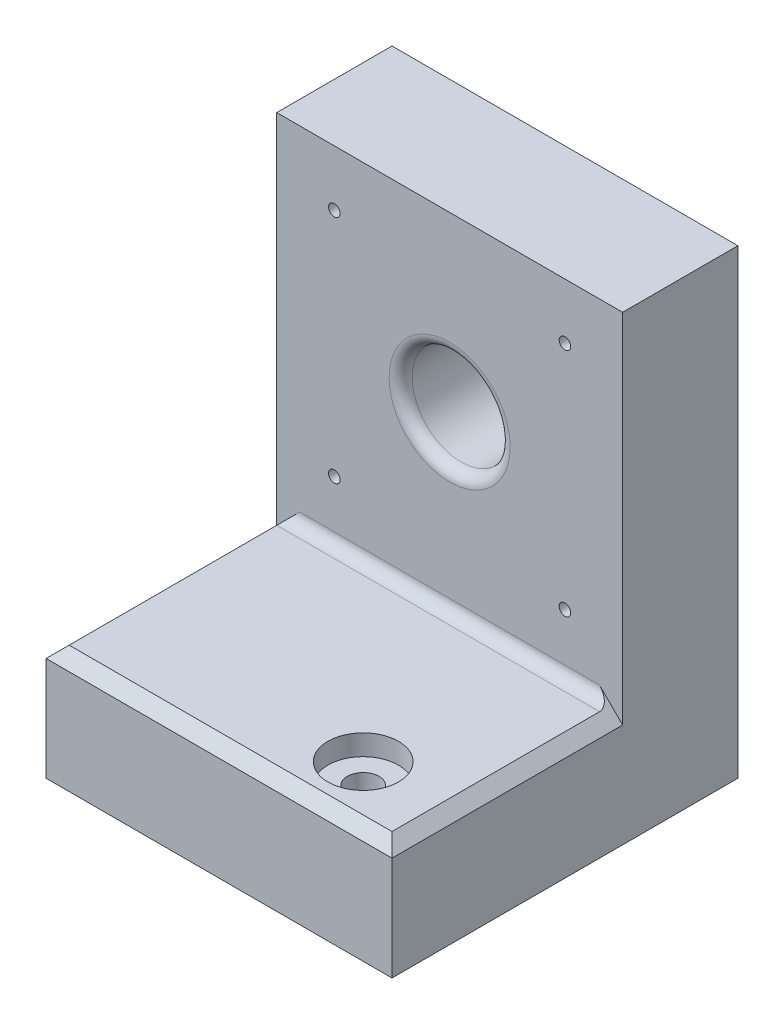
ISO-10303-21;
HEADER;
FILE_DESCRIPTION(('STEP AP214'),'2;1');
FILE_NAME('part.step','',(''),(''),'','','');
FILE_SCHEMA(('AUTOMOTIVE_DESIGN { 1 0 10303 214 1 1 1 1 }'));
ENDSEC;
DATA;
#1=APPLICATION_CONTEXT('core data for automotive mechanical design processes');
#2=APPLICATION_PROTOCOL_DEFINITION('international standard','automotive_design',2000,#1);
#3=PRODUCT_CONTEXT('',#1,'mechanical');
#4=PRODUCT('Part','Part','',(#3));
#5=PRODUCT_RELATED_PRODUCT_CATEGORY('part','',(#4));
#6=PRODUCT_DEFINITION_FORMATION('','',#4);
#7=PRODUCT_DEFINITION_CONTEXT('part definition',#1,'design');
#8=PRODUCT_DEFINITION('design','',#6,#7);
#9=PRODUCT_DEFINITION_SHAPE('','',#8);
#10=(LENGTH_UNIT() NAMED_UNIT(*) SI_UNIT(.MILLI.,.METRE.));
#11=(NAMED_UNIT(*) PLANE_ANGLE_UNIT() SI_UNIT($,.RADIAN.));
#12=(NAMED_UNIT(*) SI_UNIT($,.STERADIAN.) SOLID_ANGLE_UNIT());
#13=UNCERTAINTY_MEASURE_WITH_UNIT(LENGTH_MEASURE(1.E-05),#10,'distance_accuracy_value','');
#14=(GEOMETRIC_REPRESENTATION_CONTEXT(3) GLOBAL_UNCERTAINTY_ASSIGNED_CONTEXT((#13)) GLOBAL_UNIT_ASSIGNED_CONTEXT((#10,
#11,#12)) REPRESENTATION_CONTEXT('',''));
#15=CARTESIAN_POINT('',(0.,0.,0.));
#16=DIRECTION('',(0.,0.,1.));
#17=DIRECTION('',(1.,0.,0.));
#18=AXIS2_PLACEMENT_3D('',#15,#16,#17);
#19=CARTESIAN_POINT('',(60.,0.,0.));
#20=DIRECTION('',(0.,1.,0.));
#21=DIRECTION('',(0.,0.,1.));
#22=AXIS2_PLACEMENT_3D('',#19,#20,#21);
#23=PLANE('',#22);
#24=CARTESIAN_POINT('',(45.,0.,50.));
#25=DIRECTION('',(0.,1.,0.));
#26=DIRECTION('',(0.,0.,1.));
#27=AXIS2_PLACEMENT_3D('',#24,#25,#26);
#28=CIRCLE('',#27,2.75);
#29=CARTESIAN_POINT('',(45.,0.,52.75));
#30=VERTEX_POINT('',#29);
#31=EDGE_CURVE('E491',#30,#30,#28,.T.);
#32=ORIENTED_EDGE('',*,*,#31,.T.);
#33=EDGE_LOOP('',(#32));
#34=FACE_BOUND('',#33,.T.);
#35=DIRECTION('',(0.,0.,-1.));
#36=VECTOR('',#35,1.);
#37=CARTESIAN_POINT('',(0.,0.,0.));
#38=LINE('',#37,#36);
#39=CARTESIAN_POINT('',(0.,0.,60.));
#40=VERTEX_POINT('',#39);
#41=CARTESIAN_POINT('',(0.,0.,0.));
#42=VERTEX_POINT('',#41);
#43=EDGE_CURVE('E143',#40,#42,#38,.T.);
#44=ORIENTED_EDGE('',*,*,#43,.T.);
#45=DIRECTION('',(-1.,0.,0.));
#46=VECTOR('',#45,1.);
#47=CARTESIAN_POINT('',(60.,0.,0.));
#48=LINE('',#47,#46);
#49=CARTESIAN_POINT('',(60.,0.,0.));
#50=VERTEX_POINT('',#49);
#51=EDGE_CURVE('E123',#50,#42,#48,.T.);
#52=ORIENTED_EDGE('',*,*,#51,.F.);
#53=DIRECTION('',(0.,0.,-1.));
#54=VECTOR('',#53,1.);
#55=CARTESIAN_POINT('',(60.,0.,0.));
#56=LINE('',#55,#54);
#57=CARTESIAN_POINT('',(60.,0.,60.));
#58=VERTEX_POINT('',#57);
#59=EDGE_CURVE('E130',#58,#50,#56,.T.);
#60=ORIENTED_EDGE('',*,*,#59,.F.);
#61=DIRECTION('',(-1.,0.,0.));
#62=VECTOR('',#61,1.);
#63=CARTESIAN_POINT('',(60.,0.,60.));
#64=LINE('',#63,#62);
#65=EDGE_CURVE('E207',#58,#40,#64,.T.);
#66=ORIENTED_EDGE('',*,*,#65,.T.);
#67=EDGE_LOOP('',(#44,#52,#60,#66));
#68=FACE_BOUND('',#67,.T.);
#69=ADVANCED_FACE('F48',(#34,#68),#23,.F.);
#70=CARTESIAN_POINT('',(60.,0.,0.));
#71=DIRECTION('',(0.,0.,1.));
#72=DIRECTION('',(1.,0.,0.));
#73=AXIS2_PLACEMENT_3D('',#70,#71,#72);
#74=PLANE('',#73);
#75=CARTESIAN_POINT('',(30.,50.,0.));
#76=DIRECTION('',(0.,0.,1.));
#77=DIRECTION('',(1.,0.,0.));
#78=AXIS2_PLACEMENT_3D('',#75,#76,#77);
#79=CIRCLE('',#78,10.5);
#80=CARTESIAN_POINT('',(40.5,50.,0.));
#81=VERTEX_POINT('',#80);
#82=EDGE_CURVE('E158',#81,#81,#79,.T.);
#83=ORIENTED_EDGE('',*,*,#82,.T.);
#84=EDGE_LOOP('',(#83));
#85=FACE_BOUND('',#84,.T.);
#86=DIRECTION('',(0.,1.,0.));
#87=VECTOR('',#86,1.);
#88=CARTESIAN_POINT('',(0.,0.,0.));
#89=LINE('',#88,#87);
#90=CARTESIAN_POINT('',(0.,80.,0.));
#91=VERTEX_POINT('',#90);
#92=EDGE_CURVE('E214',#42,#91,#89,.T.);
#93=ORIENTED_EDGE('',*,*,#92,.T.);
#94=DIRECTION('',(-1.,0.,0.));
#95=VECTOR('',#94,1.);
#96=CARTESIAN_POINT('',(60.,80.,0.));
#97=LINE('',#96,#95);
#98=CARTESIAN_POINT('',(60.,80.,0.));
#99=VERTEX_POINT('',#98);
#100=EDGE_CURVE('E126',#99,#91,#97,.T.);
#101=ORIENTED_EDGE('',*,*,#100,.F.);
#102=DIRECTION('',(0.,1.,0.));
#103=VECTOR('',#102,1.);
#104=CARTESIAN_POINT('',(60.,0.,0.));
#105=LINE('',#104,#103);
#106=EDGE_CURVE('E119',#50,#99,#105,.T.);
#107=ORIENTED_EDGE('',*,*,#106,.F.);
#108=ORIENTED_EDGE('',*,*,#51,.T.);
#109=EDGE_LOOP('',(#93,#101,#107,#108));
#110=FACE_BOUND('',#109,.T.);
#111=ADVANCED_FACE('F121',(#85,#110),#74,.F.);
#112=CARTESIAN_POINT('',(60.,80.,0.));
#113=DIRECTION('',(0.,-1.,0.));
#114=DIRECTION('',(0.,0.,-1.));
#115=AXIS2_PLACEMENT_3D('',#112,#113,#114);
#116=PLANE('',#115);
#117=DIRECTION('',(0.,0.,1.));
#118=VECTOR('',#117,1.);
#119=CARTESIAN_POINT('',(0.,80.,0.));
#120=LINE('',#119,#118);
#121=CARTESIAN_POINT('',(0.,80.,20.));
#122=VERTEX_POINT('',#121);
#123=EDGE_CURVE('E217',#91,#122,#120,.T.);
#124=ORIENTED_EDGE('',*,*,#123,.T.);
#125=DIRECTION('',(-1.,0.,0.));
#126=VECTOR('',#125,1.);
#127=CARTESIAN_POINT('',(60.,80.,20.));
#128=LINE('',#127,#126);
#129=CARTESIAN_POINT('',(60.,80.,20.));
#130=VERTEX_POINT('',#129);
#131=EDGE_CURVE('E149',#130,#122,#128,.T.);
#132=ORIENTED_EDGE('',*,*,#131,.F.);
#133=DIRECTION('',(0.,0.,1.));
#134=VECTOR('',#133,1.);
#135=CARTESIAN_POINT('',(60.,80.,0.));
#136=LINE('',#135,#134);
#137=EDGE_CURVE('E129',#99,#130,#136,.T.);
#138=ORIENTED_EDGE('',*,*,#137,.F.);
#139=ORIENTED_EDGE('',*,*,#100,.T.);
#140=EDGE_LOOP('',(#124,#132,#138,#139));
#141=FACE_BOUND('',#140,.T.);
#142=ADVANCED_FACE('F240',(#141),#116,.F.);
#143=CARTESIAN_POINT('',(60.,80.,20.));
#144=DIRECTION('',(0.,0.,-1.));
#145=DIRECTION('',(0.,1.,0.));
#146=AXIS2_PLACEMENT_3D('',#143,#144,#145);
#147=PLANE('',#146);
#148=CARTESIAN_POINT('',(10.,30.3389699985161,20.));
#149=DIRECTION('',(0.,0.,1.));
#150=DIRECTION('',(1.,0.,0.));
#151=AXIS2_PLACEMENT_3D('',#148,#149,#150);
#152=CIRCLE('',#151,1.);
#153=CARTESIAN_POINT('',(11.,30.3389699985161,20.));
#154=VERTEX_POINT('',#153);
#155=EDGE_CURVE('E470',#154,#154,#152,.T.);
#156=ORIENTED_EDGE('',*,*,#155,.F.);
#157=EDGE_LOOP('',(#156));
#158=FACE_BOUND('',#157,.T.);
#159=CARTESIAN_POINT('',(50.,30.3389699985161,20.));
#160=DIRECTION('',(0.,0.,1.));
#161=DIRECTION('',(1.,0.,0.));
#162=AXIS2_PLACEMENT_3D('',#159,#160,#161);
#163=CIRCLE('',#162,0.999999999999998);
#164=CARTESIAN_POINT('',(51.,30.3389699985161,20.));
#165=VERTEX_POINT('',#164);
#166=EDGE_CURVE('E477',#165,#165,#163,.T.);
#167=ORIENTED_EDGE('',*,*,#166,.F.);
#168=EDGE_LOOP('',(#167));
#169=FACE_BOUND('',#168,.T.);
#170=CARTESIAN_POINT('',(50.,70.3389699985161,20.));
#171=DIRECTION('',(0.,0.,1.));
#172=DIRECTION('',(1.,0.,0.));
#173=AXIS2_PLACEMENT_3D('',#170,#171,#172);
#174=CIRCLE('',#173,0.999999999999998);
#175=CARTESIAN_POINT('',(51.,70.3389699985161,20.));
#176=VERTEX_POINT('',#175);
#177=EDGE_CURVE('E483',#176,#176,#174,.T.);
#178=ORIENTED_EDGE('',*,*,#177,.F.);
#179=EDGE_LOOP('',(#178));
#180=FACE_BOUND('',#179,.T.);
#181=CARTESIAN_POINT('',(10.,70.3389699985161,20.));
#182=DIRECTION('',(0.,0.,1.));
#183=DIRECTION('',(1.,0.,0.));
#184=AXIS2_PLACEMENT_3D('',#181,#182,#183);
#185=CIRCLE('',#184,1.);
#186=CARTESIAN_POINT('',(11.,70.3389699985161,20.));
#187=VERTEX_POINT('',#186);
#188=EDGE_CURVE('E464',#187,#187,#185,.T.);
#189=ORIENTED_EDGE('',*,*,#188,.F.);
#190=EDGE_LOOP('',(#189));
#191=FACE_BOUND('',#190,.T.);
#192=CARTESIAN_POINT('',(30.,50.,20.));
#193=DIRECTION('',(0.,0.,-1.));
#194=DIRECTION('',(0.,1.,0.));
#195=AXIS2_PLACEMENT_3D('',#192,#193,#194);
#196=CIRCLE('',#195,10.5);
#197=CARTESIAN_POINT('',(30.,60.5,20.));
#198=VERTEX_POINT('',#197);
#199=EDGE_CURVE('E155',#198,#198,#196,.T.);
#200=ORIENTED_EDGE('',*,*,#199,.T.);
#201=EDGE_LOOP('',(#200));
#202=FACE_BOUND('',#201,.T.);
#203=DIRECTION('',(0.707106781186548,0.707106781186548,0.));
#204=VECTOR('',#203,1.);
#205=CARTESIAN_POINT('',(61.,79.,20.));
#206=LINE('',#205,#204);
#207=CARTESIAN_POINT('',(0.,18.,20.));
#208=VERTEX_POINT('',#207);
#209=CARTESIAN_POINT('',(4.,22.,20.));
#210=VERTEX_POINT('',#209);
#211=EDGE_CURVE('E63',#208,#210,#206,.T.);
#212=ORIENTED_EDGE('',*,*,#211,.T.);
#213=DIRECTION('',(-1.,0.,0.));
#214=VECTOR('',#213,1.);
#215=CARTESIAN_POINT('',(58.,22.,20.));
#216=LINE('',#215,#214);
#217=CARTESIAN_POINT('',(56.,22.,20.));
#218=VERTEX_POINT('',#217);
#219=EDGE_CURVE('E186',#210,#218,#216,.F.);
#220=ORIENTED_EDGE('',*,*,#219,.T.);
#221=DIRECTION('',(-0.707106781186548,0.707106781186548,0.));
#222=VECTOR('',#221,1.);
#223=CARTESIAN_POINT('',(29.,49.,20.));
#224=LINE('',#223,#222);
#225=CARTESIAN_POINT('',(60.,18.,20.));
#226=VERTEX_POINT('',#225);
#227=EDGE_CURVE('E70',#218,#226,#224,.F.);
#228=ORIENTED_EDGE('',*,*,#227,.T.);
#229=DIRECTION('',(0.,-1.,0.));
#230=VECTOR('',#229,1.);
#231=CARTESIAN_POINT('',(60.,80.,20.));
#232=LINE('',#231,#230);
#233=EDGE_CURVE('E199',#130,#226,#232,.T.);
#234=ORIENTED_EDGE('',*,*,#233,.F.);
#235=ORIENTED_EDGE('',*,*,#131,.T.);
#236=DIRECTION('',(0.,-1.,0.));
#237=VECTOR('',#236,1.);
#238=CARTESIAN_POINT('',(0.,80.,20.));
#239=LINE('',#238,#237);
#240=EDGE_CURVE('E219',#122,#208,#239,.T.);
#241=ORIENTED_EDGE('',*,*,#240,.T.);
#242=EDGE_LOOP('',(#212,#220,#228,#234,#235,#241));
#243=FACE_BOUND('',#242,.T.);
#244=ADVANCED_FACE('F196',(#158,#169,#180,#191,#202,#243),#147,.F.);
#245=CARTESIAN_POINT('',(60.,20.,20.));
#246=DIRECTION('',(0.,-1.,0.));
#247=DIRECTION('',(0.,0.,-1.));
#248=AXIS2_PLACEMENT_3D('',#245,#246,#247);
#249=PLANE('',#248);
#250=CARTESIAN_POINT('',(45.,20.,50.));
#251=DIRECTION('',(0.,1.,0.));
#252=DIRECTION('',(0.,0.,1.));
#253=AXIS2_PLACEMENT_3D('',#250,#251,#252);
#254=CIRCLE('',#253,6.12);
#255=CARTESIAN_POINT('',(45.,20.,56.12));
#256=VERTEX_POINT('',#255);
#257=EDGE_CURVE('E488',#256,#256,#254,.T.);
#258=ORIENTED_EDGE('',*,*,#257,.F.);
#259=EDGE_LOOP('',(#258));
#260=FACE_BOUND('',#259,.T.);
#261=DIRECTION('',(0.,0.,-1.));
#262=VECTOR('',#261,1.);
#263=CARTESIAN_POINT('',(58.,20.,20.));
#264=LINE('',#263,#262);
#265=CARTESIAN_POINT('',(58.,20.,58.));
#266=VERTEX_POINT('',#265);
#267=CARTESIAN_POINT('',(58.,20.,22.));
#268=VERTEX_POINT('',#267);
#269=EDGE_CURVE('E167',#266,#268,#264,.T.);
#270=ORIENTED_EDGE('',*,*,#269,.T.);
#271=DIRECTION('',(-1.,0.,0.));
#272=VECTOR('',#271,1.);
#273=CARTESIAN_POINT('',(2.,20.,22.));
#274=LINE('',#273,#272);
#275=CARTESIAN_POINT('',(2.,20.,22.));
#276=VERTEX_POINT('',#275);
#277=EDGE_CURVE('E177',#268,#276,#274,.T.);
#278=ORIENTED_EDGE('',*,*,#277,.T.);
#279=DIRECTION('',(0.,0.,1.));
#280=VECTOR('',#279,1.);
#281=CARTESIAN_POINT('',(2.,20.,60.));
#282=LINE('',#281,#280);
#283=CARTESIAN_POINT('',(2.,20.,58.));
#284=VERTEX_POINT('',#283);
#285=EDGE_CURVE('E165',#276,#284,#282,.T.);
#286=ORIENTED_EDGE('',*,*,#285,.T.);
#287=DIRECTION('',(1.,0.,0.));
#288=VECTOR('',#287,1.);
#289=CARTESIAN_POINT('',(60.,20.,58.));
#290=LINE('',#289,#288);
#291=EDGE_CURVE('E163',#284,#266,#290,.T.);
#292=ORIENTED_EDGE('',*,*,#291,.T.);
#293=EDGE_LOOP('',(#270,#278,#286,#292));
#294=FACE_BOUND('',#293,.T.);
#295=ADVANCED_FACE('F231',(#260,#294),#249,.F.);
#296=CARTESIAN_POINT('',(60.,0.,60.));
#297=DIRECTION('',(0.,0.,-1.));
#298=DIRECTION('',(-1.,0.,0.));
#299=AXIS2_PLACEMENT_3D('',#296,#297,#298);
#300=PLANE('',#299);
#301=DIRECTION('',(0.,-1.,0.));
#302=VECTOR('',#301,1.);
#303=CARTESIAN_POINT('',(60.,0.,60.));
#304=LINE('',#303,#302);
#305=CARTESIAN_POINT('',(60.,18.,60.));
#306=VERTEX_POINT('',#305);
#307=EDGE_CURVE('E136',#306,#58,#304,.T.);
#308=ORIENTED_EDGE('',*,*,#307,.F.);
#309=DIRECTION('',(-1.,0.,0.));
#310=VECTOR('',#309,1.);
#311=CARTESIAN_POINT('',(60.,18.,60.));
#312=LINE('',#311,#310);
#313=CARTESIAN_POINT('',(0.,18.,60.));
#314=VERTEX_POINT('',#313);
#315=EDGE_CURVE('E173',#306,#314,#312,.T.);
#316=ORIENTED_EDGE('',*,*,#315,.T.);
#317=DIRECTION('',(0.,-1.,0.));
#318=VECTOR('',#317,1.);
#319=CARTESIAN_POINT('',(0.,0.,60.));
#320=LINE('',#319,#318);
#321=EDGE_CURVE('E140',#314,#40,#320,.T.);
#322=ORIENTED_EDGE('',*,*,#321,.T.);
#323=ORIENTED_EDGE('',*,*,#65,.F.);
#324=EDGE_LOOP('',(#308,#316,#322,#323));
#325=FACE_BOUND('',#324,.T.);
#326=ADVANCED_FACE('F205',(#325),#300,.F.);
#327=CARTESIAN_POINT('',(60.,0.,0.));
#328=DIRECTION('',(-1.,0.,0.));
#329=DIRECTION('',(0.,0.,1.));
#330=AXIS2_PLACEMENT_3D('',#327,#328,#329);
#331=PLANE('',#330);
#332=ORIENTED_EDGE('',*,*,#233,.T.);
#333=DIRECTION('',(0.,0.,1.));
#334=VECTOR('',#333,1.);
#335=CARTESIAN_POINT('',(60.,18.,0.));
#336=LINE('',#335,#334);
#337=EDGE_CURVE('E161',#226,#306,#336,.T.);
#338=ORIENTED_EDGE('',*,*,#337,.T.);
#339=ORIENTED_EDGE('',*,*,#307,.T.);
#340=ORIENTED_EDGE('',*,*,#59,.T.);
#341=ORIENTED_EDGE('',*,*,#106,.T.);
#342=ORIENTED_EDGE('',*,*,#137,.T.);
#343=EDGE_LOOP('',(#332,#338,#339,#340,#341,#342));
#344=FACE_BOUND('',#343,.T.);
#345=ADVANCED_FACE('F133',(#344),#331,.F.);
#346=CARTESIAN_POINT('',(0.,0.,0.));
#347=DIRECTION('',(-1.,0.,0.));
#348=DIRECTION('',(0.,0.,1.));
#349=AXIS2_PLACEMENT_3D('',#346,#347,#348);
#350=PLANE('',#349);
#351=ORIENTED_EDGE('',*,*,#321,.F.);
#352=DIRECTION('',(0.,0.,-1.));
#353=VECTOR('',#352,1.);
#354=CARTESIAN_POINT('',(0.,18.,20.));
#355=LINE('',#354,#353);
#356=EDGE_CURVE('E170',#314,#208,#355,.T.);
#357=ORIENTED_EDGE('',*,*,#356,.T.);
#358=ORIENTED_EDGE('',*,*,#240,.F.);
#359=ORIENTED_EDGE('',*,*,#123,.F.);
#360=ORIENTED_EDGE('',*,*,#92,.F.);
#361=ORIENTED_EDGE('',*,*,#43,.F.);
#362=EDGE_LOOP('',(#351,#357,#358,#359,#360,#361));
#363=FACE_BOUND('',#362,.T.);
#364=ADVANCED_FACE('F226',(#363),#350,.T.);
#365=CARTESIAN_POINT('',(30.,50.,0.));
#366=DIRECTION('',(0.,0.,1.));
#367=DIRECTION('',(1.,0.,0.));
#368=AXIS2_PLACEMENT_3D('',#365,#366,#367);
#369=CYLINDRICAL_SURFACE('',#368,8.5);
#370=CARTESIAN_POINT('',(30.,50.,18.));
#371=DIRECTION('',(0.,0.,-1.));
#372=DIRECTION('',(0.,1.,0.));
#373=AXIS2_PLACEMENT_3D('',#370,#371,#372);
#374=CIRCLE('',#373,8.5);
#375=CARTESIAN_POINT('',(30.,58.5,18.));
#376=VERTEX_POINT('',#375);
#377=EDGE_CURVE('E147',#376,#376,#374,.F.);
#378=ORIENTED_EDGE('',*,*,#377,.T.);
#379=EDGE_LOOP('',(#378));
#380=FACE_BOUND('',#379,.T.);
#381=CARTESIAN_POINT('',(30.,50.,2.));
#382=DIRECTION('',(0.,0.,1.));
#383=DIRECTION('',(1.,0.,0.));
#384=AXIS2_PLACEMENT_3D('',#381,#382,#383);
#385=CIRCLE('',#384,8.5);
#386=CARTESIAN_POINT('',(38.5,50.,2.));
#387=VERTEX_POINT('',#386);
#388=EDGE_CURVE('E144',#387,#387,#385,.F.);
#389=ORIENTED_EDGE('',*,*,#388,.T.);
#390=EDGE_LOOP('',(#389));
#391=FACE_BOUND('',#390,.T.);
#392=ADVANCED_FACE('F259',(#380,#391),#369,.F.);
#393=CARTESIAN_POINT('',(30.,50.,18.));
#394=DIRECTION('',(0.,0.,-1.));
#395=DIRECTION('',(0.,1.,0.));
#396=AXIS2_PLACEMENT_3D('',#393,#394,#395);
#397=TOROIDAL_SURFACE('',#396,10.5,2.);
#398=ORIENTED_EDGE('',*,*,#199,.F.);
#399=EDGE_LOOP('',(#398));
#400=FACE_BOUND('',#399,.T.);
#401=ORIENTED_EDGE('',*,*,#377,.F.);
#402=EDGE_LOOP('',(#401));
#403=FACE_BOUND('',#402,.T.);
#404=ADVANCED_FACE('F255',(#400,#403),#397,.T.);
#405=CARTESIAN_POINT('',(30.,50.,2.));
#406=DIRECTION('',(0.,0.,1.));
#407=DIRECTION('',(1.,0.,0.));
#408=AXIS2_PLACEMENT_3D('',#405,#406,#407);
#409=TOROIDAL_SURFACE('',#408,10.5,2.);
#410=ORIENTED_EDGE('',*,*,#388,.F.);
#411=EDGE_LOOP('',(#410));
#412=FACE_BOUND('',#411,.T.);
#413=ORIENTED_EDGE('',*,*,#82,.F.);
#414=EDGE_LOOP('',(#413));
#415=FACE_BOUND('',#414,.T.);
#416=ADVANCED_FACE('F258',(#412,#415),#409,.T.);
#417=CARTESIAN_POINT('',(10.,70.3389699985161,9.99999999999999));
#418=DIRECTION('',(0.,0.,1.));
#419=DIRECTION('',(1.,0.,0.));
#420=AXIS2_PLACEMENT_3D('',#417,#418,#419);
#421=CYLINDRICAL_SURFACE('',#420,1.);
#422=CARTESIAN_POINT('',(10.,70.3389699985161,9.99999999999999));
#423=DIRECTION('',(0.,0.,1.));
#424=DIRECTION('',(1.,0.,0.));
#425=AXIS2_PLACEMENT_3D('',#422,#423,#424);
#426=CIRCLE('',#425,1.);
#427=CARTESIAN_POINT('',(11.,70.3389699985161,9.99999999999999));
#428=VERTEX_POINT('',#427);
#429=EDGE_CURVE('E215',#428,#428,#426,.T.);
#430=ORIENTED_EDGE('',*,*,#429,.F.);
#431=EDGE_LOOP('',(#430));
#432=FACE_BOUND('',#431,.T.);
#433=ORIENTED_EDGE('',*,*,#188,.T.);
#434=EDGE_LOOP('',(#433));
#435=FACE_BOUND('',#434,.T.);
#436=ADVANCED_FACE('F263',(#432,#435),#421,.F.);
#437=CARTESIAN_POINT('',(10.,70.3389699985161,9.99999999999999));
#438=DIRECTION('',(0.,0.,1.));
#439=DIRECTION('',(1.,0.,0.));
#440=AXIS2_PLACEMENT_3D('',#437,#438,#439);
#441=PLANE('',#440);
#442=ORIENTED_EDGE('',*,*,#429,.T.);
#443=EDGE_LOOP('',(#442));
#444=FACE_BOUND('',#443,.T.);
#445=ADVANCED_FACE('F306',(#444),#441,.T.);
#446=CARTESIAN_POINT('',(50.,70.3389699985161,9.99999999999999));
#447=DIRECTION('',(0.,0.,1.));
#448=DIRECTION('',(1.,0.,0.));
#449=AXIS2_PLACEMENT_3D('',#446,#447,#448);
#450=CYLINDRICAL_SURFACE('',#449,0.999999999999998);
#451=CARTESIAN_POINT('',(50.,70.3389699985161,9.99999999999999));
#452=DIRECTION('',(0.,0.,1.));
#453=DIRECTION('',(1.,0.,0.));
#454=AXIS2_PLACEMENT_3D('',#451,#452,#453);
#455=CIRCLE('',#454,0.999999999999998);
#456=CARTESIAN_POINT('',(51.,70.3389699985161,9.99999999999999));
#457=VERTEX_POINT('',#456);
#458=EDGE_CURVE('E467',#457,#457,#455,.T.);
#459=ORIENTED_EDGE('',*,*,#458,.F.);
#460=EDGE_LOOP('',(#459));
#461=FACE_BOUND('',#460,.T.);
#462=ORIENTED_EDGE('',*,*,#177,.T.);
#463=EDGE_LOOP('',(#462));
#464=FACE_BOUND('',#463,.T.);
#465=ADVANCED_FACE('F302',(#461,#464),#450,.F.);
#466=CARTESIAN_POINT('',(50.,70.3389699985161,9.99999999999999));
#467=DIRECTION('',(0.,0.,1.));
#468=DIRECTION('',(1.,0.,0.));
#469=AXIS2_PLACEMENT_3D('',#466,#467,#468);
#470=PLANE('',#469);
#471=ORIENTED_EDGE('',*,*,#458,.T.);
#472=EDGE_LOOP('',(#471));
#473=FACE_BOUND('',#472,.T.);
#474=ADVANCED_FACE('F298',(#473),#470,.T.);
#475=CARTESIAN_POINT('',(50.,30.3389699985161,9.99999999999999));
#476=DIRECTION('',(0.,0.,1.));
#477=DIRECTION('',(1.,0.,0.));
#478=AXIS2_PLACEMENT_3D('',#475,#476,#477);
#479=CYLINDRICAL_SURFACE('',#478,0.999999999999998);
#480=CARTESIAN_POINT('',(50.,30.3389699985161,9.99999999999999));
#481=DIRECTION('',(0.,0.,1.));
#482=DIRECTION('',(1.,0.,0.));
#483=AXIS2_PLACEMENT_3D('',#480,#481,#482);
#484=CIRCLE('',#483,0.999999999999998);
#485=CARTESIAN_POINT('',(51.,30.3389699985161,9.99999999999999));
#486=VERTEX_POINT('',#485);
#487=EDGE_CURVE('E480',#486,#486,#484,.T.);
#488=ORIENTED_EDGE('',*,*,#487,.F.);
#489=EDGE_LOOP('',(#488));
#490=FACE_BOUND('',#489,.T.);
#491=ORIENTED_EDGE('',*,*,#166,.T.);
#492=EDGE_LOOP('',(#491));
#493=FACE_BOUND('',#492,.T.);
#494=ADVANCED_FACE('F301',(#490,#493),#479,.F.);
#495=CARTESIAN_POINT('',(50.,30.3389699985161,9.99999999999999));
#496=DIRECTION('',(0.,0.,1.));
#497=DIRECTION('',(1.,0.,0.));
#498=AXIS2_PLACEMENT_3D('',#495,#496,#497);
#499=PLANE('',#498);
#500=ORIENTED_EDGE('',*,*,#487,.T.);
#501=EDGE_LOOP('',(#500));
#502=FACE_BOUND('',#501,.T.);
#503=ADVANCED_FACE('F308',(#502),#499,.T.);
#504=CARTESIAN_POINT('',(10.,30.3389699985161,9.99999999999999));
#505=DIRECTION('',(0.,0.,1.));
#506=DIRECTION('',(1.,0.,0.));
#507=AXIS2_PLACEMENT_3D('',#504,#505,#506);
#508=CYLINDRICAL_SURFACE('',#507,1.);
#509=CARTESIAN_POINT('',(10.,30.3389699985161,9.99999999999999));
#510=DIRECTION('',(0.,0.,1.));
#511=DIRECTION('',(1.,0.,0.));
#512=AXIS2_PLACEMENT_3D('',#509,#510,#511);
#513=CIRCLE('',#512,1.);
#514=CARTESIAN_POINT('',(11.,30.3389699985161,9.99999999999999));
#515=VERTEX_POINT('',#514);
#516=EDGE_CURVE('E473',#515,#515,#513,.T.);
#517=ORIENTED_EDGE('',*,*,#516,.F.);
#518=EDGE_LOOP('',(#517));
#519=FACE_BOUND('',#518,.T.);
#520=ORIENTED_EDGE('',*,*,#155,.T.);
#521=EDGE_LOOP('',(#520));
#522=FACE_BOUND('',#521,.T.);
#523=ADVANCED_FACE('F311',(#519,#522),#508,.F.);
#524=CARTESIAN_POINT('',(10.,30.3389699985161,9.99999999999999));
#525=DIRECTION('',(0.,0.,1.));
#526=DIRECTION('',(1.,0.,0.));
#527=AXIS2_PLACEMENT_3D('',#524,#525,#526);
#528=PLANE('',#527);
#529=ORIENTED_EDGE('',*,*,#516,.T.);
#530=EDGE_LOOP('',(#529));
#531=FACE_BOUND('',#530,.T.);
#532=ADVANCED_FACE('F296',(#531),#528,.T.);
#533=CARTESIAN_POINT('',(45.,16.42,50.));
#534=DIRECTION('',(0.,1.,0.));
#535=DIRECTION('',(0.,0.,1.));
#536=AXIS2_PLACEMENT_3D('',#533,#534,#535);
#537=CYLINDRICAL_SURFACE('',#536,6.12);
#538=CARTESIAN_POINT('',(45.,16.42,50.));
#539=DIRECTION('',(0.,1.,0.));
#540=DIRECTION('',(0.,0.,1.));
#541=AXIS2_PLACEMENT_3D('',#538,#539,#540);
#542=CIRCLE('',#541,6.12);
#543=CARTESIAN_POINT('',(45.,16.42,56.12));
#544=VERTEX_POINT('',#543);
#545=EDGE_CURVE('E474',#544,#544,#542,.T.);
#546=CARTESIAN_POINT('',(45.,16.42,56.12));
#547=CARTESIAN_POINT('',(45.,16.4572916666667,56.12));
#548=CARTESIAN_POINT('',(45.,16.4945833333333,56.12));
#549=CARTESIAN_POINT('',(45.,16.5691666666667,56.12));
#550=CARTESIAN_POINT('',(45.,16.6064583333333,56.12));
#551=CARTESIAN_POINT('',(45.,16.6810416666667,56.12));
#552=CARTESIAN_POINT('',(45.,16.7183333333333,56.12));
#553=CARTESIAN_POINT('',(45.,16.7929166666667,56.12));
#554=CARTESIAN_POINT('',(45.,16.8302083333333,56.12));
#555=CARTESIAN_POINT('',(45.,16.9047916666667,56.12));
#556=CARTESIAN_POINT('',(45.,16.9420833333333,56.12));
#557=CARTESIAN_POINT('',(45.,17.0166666666667,56.12));
#558=CARTESIAN_POINT('',(45.,17.0539583333333,56.12));
#559=CARTESIAN_POINT('',(45.,17.1285416666667,56.12));
#560=CARTESIAN_POINT('',(45.,17.1658333333333,56.12));
#561=CARTESIAN_POINT('',(45.,17.2404166666667,56.12));
#562=CARTESIAN_POINT('',(45.,17.2777083333333,56.12));
#563=CARTESIAN_POINT('',(45.,17.3522916666667,56.12));
#564=CARTESIAN_POINT('',(45.,17.3895833333333,56.12));
#565=CARTESIAN_POINT('',(45.,17.4641666666667,56.12));
#566=CARTESIAN_POINT('',(45.,17.5014583333333,56.12));
#567=CARTESIAN_POINT('',(45.,17.5760416666667,56.12));
#568=CARTESIAN_POINT('',(45.,17.6133333333333,56.12));
#569=CARTESIAN_POINT('',(45.,17.6879166666667,56.12));
#570=CARTESIAN_POINT('',(45.,17.7252083333333,56.12));
#571=CARTESIAN_POINT('',(45.,17.7997916666667,56.12));
#572=CARTESIAN_POINT('',(45.,17.8370833333333,56.12));
#573=CARTESIAN_POINT('',(45.,17.9116666666667,56.12));
#574=CARTESIAN_POINT('',(45.,17.9489583333333,56.12));
#575=CARTESIAN_POINT('',(45.,18.0235416666667,56.12));
#576=CARTESIAN_POINT('',(45.,18.0608333333333,56.12));
#577=CARTESIAN_POINT('',(45.,18.1354166666667,56.12));
#578=CARTESIAN_POINT('',(45.,18.1727083333333,56.12));
#579=CARTESIAN_POINT('',(45.,18.2472916666667,56.12));
#580=CARTESIAN_POINT('',(45.,18.2845833333333,56.12));
#581=CARTESIAN_POINT('',(45.,18.3591666666667,56.12));
#582=CARTESIAN_POINT('',(45.,18.3964583333333,56.12));
#583=CARTESIAN_POINT('',(45.,18.4710416666667,56.12));
#584=CARTESIAN_POINT('',(45.,18.5083333333333,56.12));
#585=CARTESIAN_POINT('',(45.,18.5829166666667,56.12));
#586=CARTESIAN_POINT('',(45.,18.6202083333333,56.12));
#587=CARTESIAN_POINT('',(45.,18.6947916666667,56.12));
#588=CARTESIAN_POINT('',(45.,18.7320833333333,56.12));
#589=CARTESIAN_POINT('',(45.,18.8066666666667,56.12));
#590=CARTESIAN_POINT('',(45.,18.8439583333333,56.12));
#591=CARTESIAN_POINT('',(45.,18.9185416666667,56.12));
#592=CARTESIAN_POINT('',(45.,18.9558333333333,56.12));
#593=CARTESIAN_POINT('',(45.,19.0304166666667,56.12));
#594=CARTESIAN_POINT('',(45.,19.0677083333333,56.12));
#595=CARTESIAN_POINT('',(45.,19.1422916666667,56.12));
#596=CARTESIAN_POINT('',(45.,19.1795833333333,56.12));
#597=CARTESIAN_POINT('',(45.,19.2541666666667,56.12));
#598=CARTESIAN_POINT('',(45.,19.2914583333333,56.12));
#599=CARTESIAN_POINT('',(45.,19.3660416666667,56.12));
#600=CARTESIAN_POINT('',(45.,19.4033333333333,56.12));
#601=CARTESIAN_POINT('',(45.,19.4779166666667,56.12));
#602=CARTESIAN_POINT('',(45.,19.5152083333333,56.12));
#603=CARTESIAN_POINT('',(45.,19.5897916666667,56.12));
#604=CARTESIAN_POINT('',(45.,19.6270833333333,56.12));
#605=CARTESIAN_POINT('',(45.,19.7016666666667,56.12));
#606=CARTESIAN_POINT('',(45.,19.7389583333333,56.12));
#607=CARTESIAN_POINT('',(45.,19.8135416666667,56.12));
#608=CARTESIAN_POINT('',(45.,19.8508333333333,56.12));
#609=CARTESIAN_POINT('',(45.,19.9254166666667,56.12));
#610=CARTESIAN_POINT('',(45.,19.9627083333333,56.12));
#611=CARTESIAN_POINT('',(45.,20.,56.12));
#612=B_SPLINE_CURVE_WITH_KNOTS('',3,(#546,#547,#548,#549,#550,#551,#552,#553,#554,#555,#556,
#557,#558,#559,#560,#561,#562,#563,#564,#565,#566,#567,#568,#569,#570,#571,#572,#573,#574,#575,
#576,#577,#578,#579,#580,#581,#582,#583,#584,#585,#586,#587,#588,#589,#590,#591,#592,#593,#594,
#595,#596,#597,#598,#599,#600,#601,#602,#603,#604,#605,#606,#607,#608,#609,#610,#611),
.UNSPECIFIED.,.F.,.F.,(4,2,2,2,2,2,2,2,2,2,2,2,2,2,2,2,2,2,2,2,2,2,2,2,2,2,2,2,2,2,2,2,4),(0.,
0.111875000000001,0.223750000000002,0.335625000000003,0.4475,0.559375000000001,
0.671250000000002,0.783125000000003,0.895,1.006875,1.11875,1.230625,1.3425,1.454375,1.56625,
1.678125,1.79,1.901875,2.01375,2.125625,2.2375,2.349375,2.46125,2.573125,2.685,2.796875,2.90875,
3.020625,3.1325,3.244375,3.35625,3.468125,3.58),.UNSPECIFIED.);
#613=EDGE_CURVE('BSEAM288',#544,#256,#612,.T.);
#614=ORIENTED_EDGE('',*,*,#545,.F.);
#615=ORIENTED_EDGE('',*,*,#257,.T.);
#616=ORIENTED_EDGE('',*,*,#613,.T.);
#617=ORIENTED_EDGE('',*,*,#613,.F.);
#618=EDGE_LOOP('',(#614,#616,#615,#617));
#619=FACE_BOUND('',#618,.T.);
#620=ADVANCED_FACE('F288',(#619),#537,.F.);
#621=CARTESIAN_POINT('',(45.,16.42,50.));
#622=DIRECTION('',(0.,1.,0.));
#623=DIRECTION('',(0.,0.,1.));
#624=AXIS2_PLACEMENT_3D('',#621,#622,#623);
#625=PLANE('',#624);
#626=CARTESIAN_POINT('',(45.,16.42,50.));
#627=DIRECTION('',(0.,1.,0.));
#628=DIRECTION('',(0.,0.,1.));
#629=AXIS2_PLACEMENT_3D('',#626,#627,#628);
#630=CIRCLE('',#629,2.75);
#631=CARTESIAN_POINT('',(45.,16.42,52.75));
#632=VERTEX_POINT('',#631);
#633=EDGE_CURVE('E183',#632,#632,#630,.T.);
#634=ORIENTED_EDGE('',*,*,#633,.F.);
#635=EDGE_LOOP('',(#634));
#636=FACE_BOUND('',#635,.T.);
#637=ORIENTED_EDGE('',*,*,#545,.T.);
#638=EDGE_LOOP('',(#637));
#639=FACE_BOUND('',#638,.T.);
#640=ADVANCED_FACE('F282',(#636,#639),#625,.T.);
#641=CARTESIAN_POINT('',(45.,0.,50.));
#642=DIRECTION('',(0.,1.,0.));
#643=DIRECTION('',(0.,0.,1.));
#644=AXIS2_PLACEMENT_3D('',#641,#642,#643);
#645=CYLINDRICAL_SURFACE('',#644,2.75);
#646=ORIENTED_EDGE('',*,*,#31,.F.);
#647=EDGE_LOOP('',(#646));
#648=FACE_BOUND('',#647,.T.);
#649=ORIENTED_EDGE('',*,*,#633,.T.);
#650=EDGE_LOOP('',(#649));
#651=FACE_BOUND('',#650,.T.);
#652=ADVANCED_FACE('F278',(#648,#651),#645,.F.);
#653=CARTESIAN_POINT('',(2.,20.,20.));
#654=DIRECTION('',(-0.707106781186547,0.707106781186547,0.));
#655=DIRECTION('',(0.,0.,-1.));
#656=AXIS2_PLACEMENT_3D('',#653,#654,#655);
#657=PLANE('',#656);
#658=ORIENTED_EDGE('',*,*,#211,.F.);
#659=ORIENTED_EDGE('',*,*,#356,.F.);
#660=DIRECTION('',(0.577350269189626,0.577350269189626,-0.577350269189626));
#661=VECTOR('',#660,1.);
#662=CARTESIAN_POINT('',(20.,38.,40.));
#663=LINE('',#662,#661);
#664=EDGE_CURVE('E180',#284,#314,#663,.F.);
#665=ORIENTED_EDGE('',*,*,#664,.F.);
#666=ORIENTED_EDGE('',*,*,#285,.F.);
#667=CARTESIAN_POINT('',(4.,22.,22.));
#668=DIRECTION('',(-0.707106781186547,0.707106781186547,0.));
#669=DIRECTION('',(0.707106781186548,0.707106781186548,0.));
#670=AXIS2_PLACEMENT_3D('',#667,#668,#669);
#671=ELLIPSE('',#670,2.82842712474619,2.);
#672=EDGE_CURVE('E56',#276,#210,#671,.F.);
#673=ORIENTED_EDGE('',*,*,#672,.T.);
#674=EDGE_LOOP('',(#658,#659,#665,#666,#673));
#675=FACE_BOUND('',#674,.T.);
#676=ADVANCED_FACE('F190',(#675),#657,.T.);
#677=CARTESIAN_POINT('',(60.,18.,60.));
#678=DIRECTION('',(0.,-0.707106781186547,-0.707106781186547));
#679=DIRECTION('',(-1.,0.,0.));
#680=AXIS2_PLACEMENT_3D('',#677,#678,#679);
#681=PLANE('',#680);
#682=ORIENTED_EDGE('',*,*,#664,.T.);
#683=ORIENTED_EDGE('',*,*,#315,.F.);
#684=DIRECTION('',(-0.577350269189626,0.577350269189626,-0.577350269189626));
#685=VECTOR('',#684,1.);
#686=CARTESIAN_POINT('',(60.,18.,60.));
#687=LINE('',#686,#685);
#688=EDGE_CURVE('E178',#266,#306,#687,.F.);
#689=ORIENTED_EDGE('',*,*,#688,.F.);
#690=ORIENTED_EDGE('',*,*,#291,.F.);
#691=EDGE_LOOP('',(#682,#683,#689,#690));
#692=FACE_BOUND('',#691,.T.);
#693=ADVANCED_FACE('F229',(#692),#681,.F.);
#694=CARTESIAN_POINT('',(60.,18.,0.));
#695=DIRECTION('',(-0.707106781186547,-0.707106781186547,0.));
#696=DIRECTION('',(0.,0.,1.));
#697=AXIS2_PLACEMENT_3D('',#694,#695,#696);
#698=PLANE('',#697);
#699=ORIENTED_EDGE('',*,*,#227,.F.);
#700=CARTESIAN_POINT('',(56.,22.,22.));
#701=DIRECTION('',(-0.707106781186547,-0.707106781186547,0.));
#702=DIRECTION('',(0.707106781186548,-0.707106781186548,0.));
#703=AXIS2_PLACEMENT_3D('',#700,#701,#702);
#704=ELLIPSE('',#703,2.82842712474619,2.);
#705=EDGE_CURVE('E13',#218,#268,#704,.T.);
#706=ORIENTED_EDGE('',*,*,#705,.T.);
#707=ORIENTED_EDGE('',*,*,#269,.F.);
#708=ORIENTED_EDGE('',*,*,#688,.T.);
#709=ORIENTED_EDGE('',*,*,#337,.F.);
#710=EDGE_LOOP('',(#699,#706,#707,#708,#709));
#711=FACE_BOUND('',#710,.T.);
#712=ADVANCED_FACE('F200',(#711),#698,.F.);
#713=CARTESIAN_POINT('',(60.,22.,22.));
#714=DIRECTION('',(1.,0.,0.));
#715=DIRECTION('',(0.,0.,-1.));
#716=AXIS2_PLACEMENT_3D('',#713,#714,#715);
#717=CYLINDRICAL_SURFACE('',#716,2.);
#718=ORIENTED_EDGE('',*,*,#705,.F.);
#719=ORIENTED_EDGE('',*,*,#219,.F.);
#720=ORIENTED_EDGE('',*,*,#672,.F.);
#721=ORIENTED_EDGE('',*,*,#277,.F.);
#722=EDGE_LOOP('',(#718,#719,#720,#721));
#723=FACE_BOUND('',#722,.T.);
#724=ADVANCED_FACE('F50',(#723),#717,.F.);
#725=CLOSED_SHELL('',(#69,#111,#142,#244,#295,#326,#345,#364,#392,#404,#416,#436,#445,#465,#474,
#494,#503,#523,#532,#620,#640,#652,#676,#693,#712,#724));
#726=MANIFOLD_SOLID_BREP('B2',#725);
#727=ADVANCED_BREP_SHAPE_REPRESENTATION('',(#18,#726),#14);
#728=SHAPE_DEFINITION_REPRESENTATION(#9,#727);
ENDSEC;
END-ISO-10303-21;
